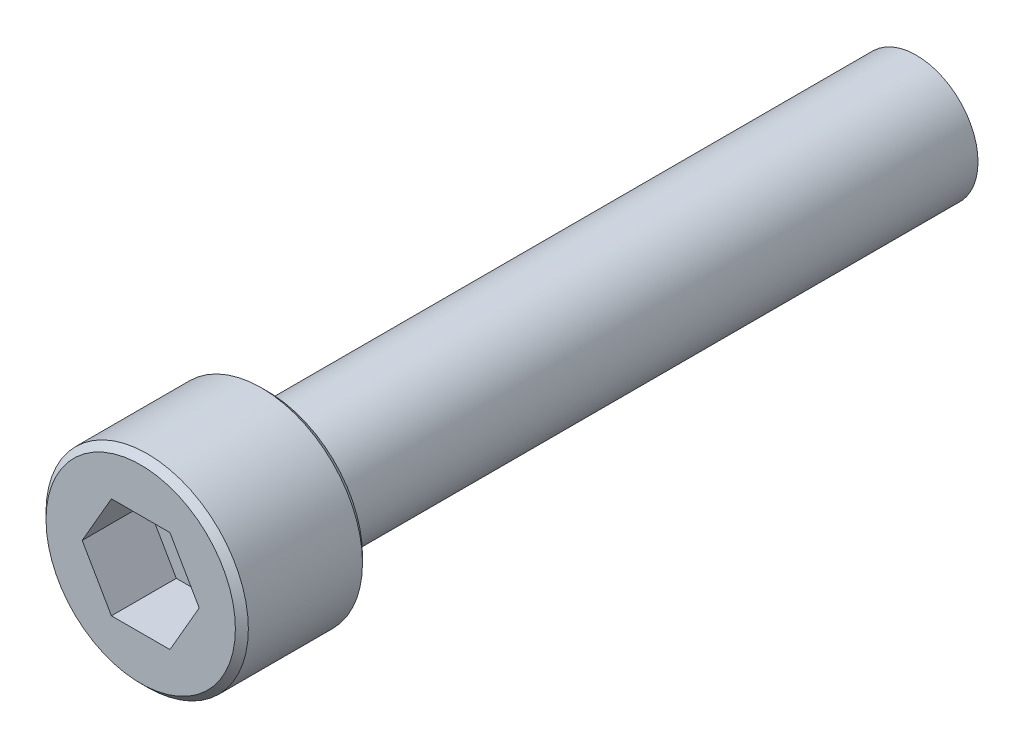
ISO-10303-21;
HEADER;
FILE_DESCRIPTION(('STEP AP214'),'2;1');
FILE_NAME('part.step','',(''),(''),'','','');
FILE_SCHEMA(('AUTOMOTIVE_DESIGN { 1 0 10303 214 1 1 1 1 }'));
ENDSEC;
DATA;
#1=APPLICATION_CONTEXT('core data for automotive mechanical design processes');
#2=APPLICATION_PROTOCOL_DEFINITION('international standard','automotive_design',2000,#1);
#3=PRODUCT_CONTEXT('',#1,'mechanical');
#4=PRODUCT('Part','Part','',(#3));
#5=PRODUCT_RELATED_PRODUCT_CATEGORY('part','',(#4));
#6=PRODUCT_DEFINITION_FORMATION('','',#4);
#7=PRODUCT_DEFINITION_CONTEXT('part definition',#1,'design');
#8=PRODUCT_DEFINITION('design','',#6,#7);
#9=PRODUCT_DEFINITION_SHAPE('','',#8);
#10=(LENGTH_UNIT() NAMED_UNIT(*) SI_UNIT(.MILLI.,.METRE.));
#11=(NAMED_UNIT(*) PLANE_ANGLE_UNIT() SI_UNIT($,.RADIAN.));
#12=(NAMED_UNIT(*) SI_UNIT($,.STERADIAN.) SOLID_ANGLE_UNIT());
#13=UNCERTAINTY_MEASURE_WITH_UNIT(LENGTH_MEASURE(1.E-05),#10,'distance_accuracy_value','');
#14=(GEOMETRIC_REPRESENTATION_CONTEXT(3) GLOBAL_UNCERTAINTY_ASSIGNED_CONTEXT((#13)) GLOBAL_UNIT_ASSIGNED_CONTEXT((#10,
#11,#12)) REPRESENTATION_CONTEXT('',''));
#15=CARTESIAN_POINT('',(0.,0.,0.));
#16=DIRECTION('',(0.,0.,1.));
#17=DIRECTION('',(1.,0.,0.));
#18=AXIS2_PLACEMENT_3D('',#15,#16,#17);
#19=CARTESIAN_POINT('',(0.,0.,27.8384));
#20=DIRECTION('',(0.,0.,1.));
#21=DIRECTION('',(1.,0.,0.));
#22=AXIS2_PLACEMENT_3D('',#19,#20,#21);
#23=PLANE('',#22);
#24=DIRECTION('',(0.5,0.866025403784439,0.));
#25=VECTOR('',#24,1.);
#26=CARTESIAN_POINT('',(1.14567944042318,-1.984375,27.8384));
#27=LINE('',#26,#25);
#28=CARTESIAN_POINT('',(1.14567944042318,-1.984375,27.8384));
#29=VERTEX_POINT('',#28);
#30=CARTESIAN_POINT('',(2.29135888084633,0.,27.8384));
#31=VERTEX_POINT('',#30);
#32=EDGE_CURVE('E133',#29,#31,#27,.T.);
#33=ORIENTED_EDGE('',*,*,#32,.T.);
#34=DIRECTION('',(-0.5,0.866025403784439,0.));
#35=VECTOR('',#34,1.);
#36=CARTESIAN_POINT('',(2.29135888084633,0.,27.8384));
#37=LINE('',#36,#35);
#38=CARTESIAN_POINT('',(1.14567944042316,1.984375,27.8384));
#39=VERTEX_POINT('',#38);
#40=EDGE_CURVE('E128',#31,#39,#37,.T.);
#41=ORIENTED_EDGE('',*,*,#40,.T.);
#42=DIRECTION('',(1.,0.,0.));
#43=VECTOR('',#42,1.);
#44=CARTESIAN_POINT('',(1.14567944042315,1.984375,27.8384));
#45=LINE('',#44,#43);
#46=CARTESIAN_POINT('',(-1.14567944042318,1.984375,27.8384));
#47=VERTEX_POINT('',#46);
#48=EDGE_CURVE('E73',#39,#47,#45,.F.);
#49=ORIENTED_EDGE('',*,*,#48,.T.);
#50=DIRECTION('',(-0.5,-0.866025403784439,0.));
#51=VECTOR('',#50,1.);
#52=CARTESIAN_POINT('',(-1.14567944042318,1.984375,27.8384));
#53=LINE('',#52,#51);
#54=CARTESIAN_POINT('',(-2.29135888084633,0.,27.8384));
#55=VERTEX_POINT('',#54);
#56=EDGE_CURVE('E70',#47,#55,#53,.T.);
#57=ORIENTED_EDGE('',*,*,#56,.T.);
#58=DIRECTION('',(0.5,-0.866025403784438,0.));
#59=VECTOR('',#58,1.);
#60=CARTESIAN_POINT('',(-2.29135888084633,0.,27.8384));
#61=LINE('',#60,#59);
#62=CARTESIAN_POINT('',(-1.14567944042315,-1.984375,27.8384));
#63=VERTEX_POINT('',#62);
#64=EDGE_CURVE('E67',#55,#63,#61,.T.);
#65=ORIENTED_EDGE('',*,*,#64,.T.);
#66=DIRECTION('',(1.,0.,0.));
#67=VECTOR('',#66,1.);
#68=CARTESIAN_POINT('',(-1.14567944042315,-1.984375,27.8384));
#69=LINE('',#68,#67);
#70=EDGE_CURVE('E90',#63,#29,#69,.T.);
#71=ORIENTED_EDGE('',*,*,#70,.T.);
#72=EDGE_LOOP('',(#33,#41,#49,#57,#65,#71));
#73=FACE_BOUND('',#72,.T.);
#74=ADVANCED_FACE('F16',(#73),#23,.T.);
#75=CARTESIAN_POINT('',(-1.14567944042318,1.984375,30.3784));
#76=DIRECTION('',(-0.866025403784439,0.5,0.));
#77=DIRECTION('',(-0.5,-0.866025403784439,0.));
#78=AXIS2_PLACEMENT_3D('',#75,#76,#77);
#79=PLANE('',#78);
#80=DIRECTION('',(0.,0.,1.));
#81=VECTOR('',#80,1.);
#82=CARTESIAN_POINT('',(-1.14567944042318,1.984375,30.3784));
#83=LINE('',#82,#81);
#84=CARTESIAN_POINT('',(-1.14567944042318,1.984375,30.3784));
#85=VERTEX_POINT('',#84);
#86=EDGE_CURVE('E126',#47,#85,#83,.T.);
#87=ORIENTED_EDGE('',*,*,#86,.T.);
#88=DIRECTION('',(-0.499999999999996,-0.866025403784441,0.));
#89=VECTOR('',#88,1.);
#90=CARTESIAN_POINT('',(-1.14567944042318,1.984375,30.3784));
#91=LINE('',#90,#89);
#92=CARTESIAN_POINT('',(-2.29135888084633,0.,30.3784));
#93=VERTEX_POINT('',#92);
#94=EDGE_CURVE('E81',#85,#93,#91,.T.);
#95=ORIENTED_EDGE('',*,*,#94,.T.);
#96=DIRECTION('',(0.,0.,1.));
#97=VECTOR('',#96,1.);
#98=CARTESIAN_POINT('',(-2.29135888084633,0.,30.3784));
#99=LINE('',#98,#97);
#100=EDGE_CURVE('E76',#93,#55,#99,.F.);
#101=ORIENTED_EDGE('',*,*,#100,.T.);
#102=ORIENTED_EDGE('',*,*,#56,.F.);
#103=EDGE_LOOP('',(#87,#95,#101,#102));
#104=FACE_BOUND('',#103,.T.);
#105=ADVANCED_FACE('F79',(#104),#79,.F.);
#106=CARTESIAN_POINT('',(-2.29135888084633,0.,30.3784));
#107=DIRECTION('',(-0.866025403784438,-0.5,0.));
#108=DIRECTION('',(0.5,-0.866025403784438,0.));
#109=AXIS2_PLACEMENT_3D('',#106,#107,#108);
#110=PLANE('',#109);
#111=ORIENTED_EDGE('',*,*,#100,.F.);
#112=DIRECTION('',(0.500000000000004,-0.866025403784436,0.));
#113=VECTOR('',#112,1.);
#114=CARTESIAN_POINT('',(-2.29135888084633,0.,30.3784));
#115=LINE('',#114,#113);
#116=CARTESIAN_POINT('',(-1.14567944042316,-1.984375,30.3784));
#117=VERTEX_POINT('',#116);
#118=EDGE_CURVE('E120',#93,#117,#115,.T.);
#119=ORIENTED_EDGE('',*,*,#118,.T.);
#120=DIRECTION('',(0.,0.,-1.));
#121=VECTOR('',#120,1.);
#122=CARTESIAN_POINT('',(-1.14567944042315,-1.984375,30.3784));
#123=LINE('',#122,#121);
#124=EDGE_CURVE('E87',#117,#63,#123,.T.);
#125=ORIENTED_EDGE('',*,*,#124,.T.);
#126=ORIENTED_EDGE('',*,*,#64,.F.);
#127=EDGE_LOOP('',(#111,#119,#125,#126));
#128=FACE_BOUND('',#127,.T.);
#129=ADVANCED_FACE('F85',(#128),#110,.F.);
#130=CARTESIAN_POINT('',(-1.14567944042315,-1.984375,30.3784));
#131=DIRECTION('',(0.,-1.,0.));
#132=DIRECTION('',(0.,0.,-1.));
#133=AXIS2_PLACEMENT_3D('',#130,#131,#132);
#134=PLANE('',#133);
#135=ORIENTED_EDGE('',*,*,#124,.F.);
#136=DIRECTION('',(-1.,0.,0.));
#137=VECTOR('',#136,1.);
#138=CARTESIAN_POINT('',(0.,-1.984375,30.3784));
#139=LINE('',#138,#137);
#140=CARTESIAN_POINT('',(1.14567944042318,-1.984375,30.3784));
#141=VERTEX_POINT('',#140);
#142=EDGE_CURVE('E118',#117,#141,#139,.F.);
#143=ORIENTED_EDGE('',*,*,#142,.T.);
#144=DIRECTION('',(0.,0.,1.));
#145=VECTOR('',#144,1.);
#146=CARTESIAN_POINT('',(1.14567944042318,-1.984375,30.3784));
#147=LINE('',#146,#145);
#148=EDGE_CURVE('E135',#141,#29,#147,.F.);
#149=ORIENTED_EDGE('',*,*,#148,.T.);
#150=ORIENTED_EDGE('',*,*,#70,.F.);
#151=EDGE_LOOP('',(#135,#143,#149,#150));
#152=FACE_BOUND('',#151,.T.);
#153=ADVANCED_FACE('F140',(#152),#134,.F.);
#154=CARTESIAN_POINT('',(1.14567944042318,-1.984375,30.3784));
#155=DIRECTION('',(0.866025403784439,-0.5,0.));
#156=DIRECTION('',(0.5,0.866025403784439,0.));
#157=AXIS2_PLACEMENT_3D('',#154,#155,#156);
#158=PLANE('',#157);
#159=ORIENTED_EDGE('',*,*,#148,.F.);
#160=DIRECTION('',(0.499999999999996,0.866025403784441,0.));
#161=VECTOR('',#160,1.);
#162=CARTESIAN_POINT('',(1.14567944042318,-1.984375,30.3784));
#163=LINE('',#162,#161);
#164=CARTESIAN_POINT('',(2.29135888084633,0.,30.3784));
#165=VERTEX_POINT('',#164);
#166=EDGE_CURVE('E116',#141,#165,#163,.T.);
#167=ORIENTED_EDGE('',*,*,#166,.T.);
#168=DIRECTION('',(0.,0.,1.));
#169=VECTOR('',#168,1.);
#170=CARTESIAN_POINT('',(2.29135888084633,0.,30.3784));
#171=LINE('',#170,#169);
#172=EDGE_CURVE('E130',#165,#31,#171,.F.);
#173=ORIENTED_EDGE('',*,*,#172,.T.);
#174=ORIENTED_EDGE('',*,*,#32,.F.);
#175=EDGE_LOOP('',(#159,#167,#173,#174));
#176=FACE_BOUND('',#175,.T.);
#177=ADVANCED_FACE('F144',(#176),#158,.F.);
#178=CARTESIAN_POINT('',(2.29135888084633,0.,30.3784));
#179=DIRECTION('',(0.866025403784439,0.5,0.));
#180=DIRECTION('',(-0.5,0.866025403784439,0.));
#181=AXIS2_PLACEMENT_3D('',#178,#179,#180);
#182=PLANE('',#181);
#183=ORIENTED_EDGE('',*,*,#172,.F.);
#184=DIRECTION('',(-0.500000000000004,0.866025403784436,0.));
#185=VECTOR('',#184,1.);
#186=CARTESIAN_POINT('',(2.29135888084633,0.,30.3784));
#187=LINE('',#186,#185);
#188=CARTESIAN_POINT('',(1.14567944042316,1.984375,30.3784));
#189=VERTEX_POINT('',#188);
#190=EDGE_CURVE('E34',#165,#189,#187,.T.);
#191=ORIENTED_EDGE('',*,*,#190,.T.);
#192=DIRECTION('',(0.,0.,1.));
#193=VECTOR('',#192,1.);
#194=CARTESIAN_POINT('',(1.14567944042315,1.984375,30.3784));
#195=LINE('',#194,#193);
#196=EDGE_CURVE('E124',#189,#39,#195,.F.);
#197=ORIENTED_EDGE('',*,*,#196,.T.);
#198=ORIENTED_EDGE('',*,*,#40,.F.);
#199=EDGE_LOOP('',(#183,#191,#197,#198));
#200=FACE_BOUND('',#199,.T.);
#201=ADVANCED_FACE('F146',(#200),#182,.F.);
#202=CARTESIAN_POINT('',(1.14567944042315,1.984375,30.3784));
#203=DIRECTION('',(0.,1.,0.));
#204=DIRECTION('',(0.,0.,1.));
#205=AXIS2_PLACEMENT_3D('',#202,#203,#204);
#206=PLANE('',#205);
#207=ORIENTED_EDGE('',*,*,#196,.F.);
#208=DIRECTION('',(-1.,0.,0.));
#209=VECTOR('',#208,1.);
#210=CARTESIAN_POINT('',(0.,1.984375,30.3784));
#211=LINE('',#210,#209);
#212=EDGE_CURVE('E112',#189,#85,#211,.T.);
#213=ORIENTED_EDGE('',*,*,#212,.T.);
#214=ORIENTED_EDGE('',*,*,#86,.F.);
#215=ORIENTED_EDGE('',*,*,#48,.F.);
#216=EDGE_LOOP('',(#207,#213,#214,#215));
#217=FACE_BOUND('',#216,.T.);
#218=ADVANCED_FACE('F149',(#217),#206,.F.);
#219=CARTESIAN_POINT('',(0.,0.,30.3784));
#220=DIRECTION('',(0.,0.,-1.));
#221=DIRECTION('',(-1.,0.,0.));
#222=AXIS2_PLACEMENT_3D('',#219,#220,#221);
#223=PLANE('',#222);
#224=ORIENTED_EDGE('',*,*,#190,.F.);
#225=ORIENTED_EDGE('',*,*,#166,.F.);
#226=ORIENTED_EDGE('',*,*,#142,.F.);
#227=ORIENTED_EDGE('',*,*,#118,.F.);
#228=ORIENTED_EDGE('',*,*,#94,.F.);
#229=ORIENTED_EDGE('',*,*,#212,.F.);
#230=EDGE_LOOP('',(#224,#225,#226,#227,#228,#229));
#231=FACE_BOUND('',#230,.T.);
#232=CARTESIAN_POINT('',(0.,0.,30.3784000001883));
#233=DIRECTION('',(0.,0.,-1.));
#234=DIRECTION('',(-1.,0.,0.));
#235=AXIS2_PLACEMENT_3D('',#232,#233,#234);
#236=CIRCLE('',#235,3.70840000005046);
#237=CARTESIAN_POINT('',(-3.70840000005046,0.,30.3784000001883));
#238=VERTEX_POINT('',#237);
#239=EDGE_CURVE('E19',#238,#238,#236,.T.);
#240=ORIENTED_EDGE('',*,*,#239,.F.);
#241=EDGE_LOOP('',(#240));
#242=FACE_BOUND('',#241,.T.);
#243=ADVANCED_FACE('F151',(#231,#242),#223,.F.);
#244=CARTESIAN_POINT('',(0.,0.,30.124399999977));
#245=DIRECTION('',(0.,0.,-1.));
#246=DIRECTION('',(-1.,0.,0.));
#247=AXIS2_PLACEMENT_3D('',#244,#245,#246);
#248=CONICAL_SURFACE('',#247,3.96239999986392,0.785398162614173);
#249=CARTESIAN_POINT('',(0.,0.,30.1244));
#250=DIRECTION('',(0.,0.,1.));
#251=DIRECTION('',(1.,0.,0.));
#252=AXIS2_PLACEMENT_3D('',#249,#250,#251);
#253=CIRCLE('',#252,3.9624);
#254=CARTESIAN_POINT('',(3.9624,0.,30.1244));
#255=VERTEX_POINT('',#254);
#256=EDGE_CURVE('E101',#255,#255,#253,.F.);
#257=ORIENTED_EDGE('',*,*,#256,.F.);
#258=EDGE_LOOP('',(#257));
#259=FACE_BOUND('',#258,.T.);
#260=ORIENTED_EDGE('',*,*,#239,.T.);
#261=EDGE_LOOP('',(#260));
#262=FACE_BOUND('',#261,.T.);
#263=ADVANCED_FACE('F154',(#259,#262),#248,.T.);
#264=CARTESIAN_POINT('',(0.,0.,25.4));
#265=DIRECTION('',(0.,0.,1.));
#266=DIRECTION('',(1.,0.,0.));
#267=AXIS2_PLACEMENT_3D('',#264,#265,#266);
#268=CYLINDRICAL_SURFACE('',#267,3.9624);
#269=CARTESIAN_POINT('',(0.,0.,25.6540000001451));
#270=DIRECTION('',(0.,0.,1.));
#271=DIRECTION('',(-1.,0.,0.));
#272=AXIS2_PLACEMENT_3D('',#269,#270,#271);
#273=CIRCLE('',#272,3.96239999986392);
#274=CARTESIAN_POINT('',(-3.96239999986392,0.,25.6540000001451));
#275=VERTEX_POINT('',#274);
#276=EDGE_CURVE('E97',#275,#275,#273,.F.);
#277=ORIENTED_EDGE('',*,*,#276,.F.);
#278=EDGE_LOOP('',(#277));
#279=FACE_BOUND('',#278,.T.);
#280=ORIENTED_EDGE('',*,*,#256,.T.);
#281=EDGE_LOOP('',(#280));
#282=FACE_BOUND('',#281,.T.);
#283=ADVANCED_FACE('F160',(#279,#282),#268,.T.);
#284=CARTESIAN_POINT('',(0.,0.,25.6540000001451));
#285=DIRECTION('',(0.,0.,1.));
#286=DIRECTION('',(1.,0.,0.));
#287=AXIS2_PLACEMENT_3D('',#284,#285,#286);
#288=CONICAL_SURFACE('',#287,3.96239999986392,0.78539816239038);
#289=CARTESIAN_POINT('',(0.,0.,25.3999999999337));
#290=DIRECTION('',(0.,0.,1.));
#291=DIRECTION('',(1.,0.,0.));
#292=AXIS2_PLACEMENT_3D('',#289,#290,#291);
#293=CIRCLE('',#292,3.70840000016415);
#294=CARTESIAN_POINT('',(3.70840000016415,0.,25.3999999999337));
#295=VERTEX_POINT('',#294);
#296=EDGE_CURVE('E95',#295,#295,#293,.F.);
#297=ORIENTED_EDGE('',*,*,#296,.F.);
#298=EDGE_LOOP('',(#297));
#299=FACE_BOUND('',#298,.T.);
#300=ORIENTED_EDGE('',*,*,#276,.T.);
#301=EDGE_LOOP('',(#300));
#302=FACE_BOUND('',#301,.T.);
#303=ADVANCED_FACE('F168',(#299,#302),#288,.T.);
#304=CARTESIAN_POINT('',(0.,0.,25.4));
#305=DIRECTION('',(0.,0.,-1.));
#306=DIRECTION('',(-1.,0.,0.));
#307=AXIS2_PLACEMENT_3D('',#304,#305,#306);
#308=PLANE('',#307);
#309=CARTESIAN_POINT('',(0.,0.,25.4));
#310=DIRECTION('',(0.,0.,1.));
#311=DIRECTION('',(1.,0.,0.));
#312=AXIS2_PLACEMENT_3D('',#309,#310,#311);
#313=CIRCLE('',#312,2.413);
#314=CARTESIAN_POINT('',(2.413,0.,25.4));
#315=VERTEX_POINT('',#314);
#316=EDGE_CURVE('E25',#315,#315,#313,.F.);
#317=ORIENTED_EDGE('',*,*,#316,.F.);
#318=EDGE_LOOP('',(#317));
#319=FACE_BOUND('',#318,.T.);
#320=ORIENTED_EDGE('',*,*,#296,.T.);
#321=EDGE_LOOP('',(#320));
#322=FACE_BOUND('',#321,.T.);
#323=ADVANCED_FACE('F181',(#319,#322),#308,.T.);
#324=CARTESIAN_POINT('',(0.,0.,0.));
#325=DIRECTION('',(0.,0.,-1.));
#326=DIRECTION('',(-1.,0.,0.));
#327=AXIS2_PLACEMENT_3D('',#324,#325,#326);
#328=PLANE('',#327);
#329=CARTESIAN_POINT('',(0.,0.,0.));
#330=DIRECTION('',(0.,0.,1.));
#331=DIRECTION('',(1.,0.,0.));
#332=AXIS2_PLACEMENT_3D('',#329,#330,#331);
#333=CIRCLE('',#332,2.413);
#334=CARTESIAN_POINT('',(2.413,0.,0.));
#335=VERTEX_POINT('',#334);
#336=EDGE_CURVE('E11',#335,#335,#333,.T.);
#337=ORIENTED_EDGE('',*,*,#336,.F.);
#338=EDGE_LOOP('',(#337));
#339=FACE_BOUND('',#338,.T.);
#340=ADVANCED_FACE('F174',(#339),#328,.T.);
#341=CARTESIAN_POINT('',(0.,0.,0.));
#342=DIRECTION('',(0.,0.,1.));
#343=DIRECTION('',(1.,0.,0.));
#344=AXIS2_PLACEMENT_3D('',#341,#342,#343);
#345=CYLINDRICAL_SURFACE('',#344,2.413);
#346=ORIENTED_EDGE('',*,*,#336,.T.);
#347=EDGE_LOOP('',(#346));
#348=FACE_BOUND('',#347,.T.);
#349=ORIENTED_EDGE('',*,*,#316,.T.);
#350=EDGE_LOOP('',(#349));
#351=FACE_BOUND('',#350,.T.);
#352=ADVANCED_FACE('F172',(#348,#351),#345,.T.);
#353=CLOSED_SHELL('',(#74,#105,#129,#153,#177,#201,#218,#243,#263,#283,#303,#323,#340,#352));
#354=MANIFOLD_SOLID_BREP('B1',#353);
#355=ADVANCED_BREP_SHAPE_REPRESENTATION('',(#18,#354),#14);
#356=SHAPE_DEFINITION_REPRESENTATION(#9,#355);
ENDSEC;
END-ISO-10303-21;
